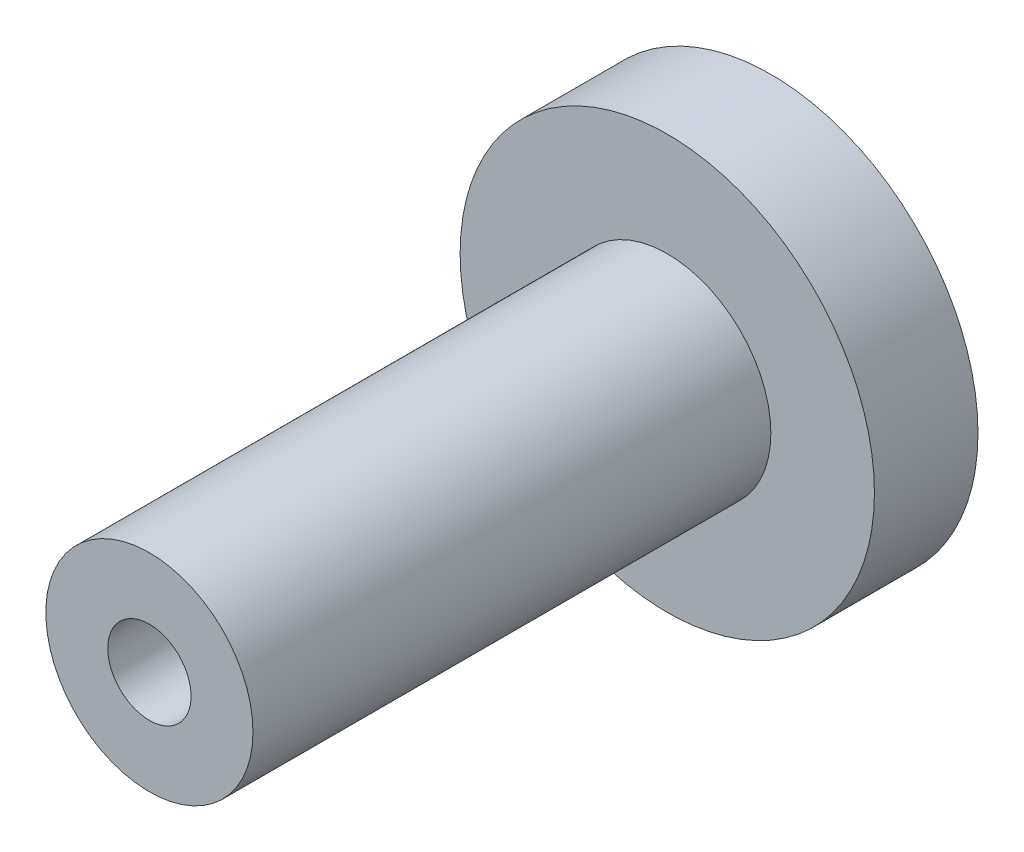
ISO-10303-21;
HEADER;
FILE_DESCRIPTION(('STEP AP214'),'2;1');
FILE_NAME('part.step','',(''),(''),'','','');
FILE_SCHEMA(('AUTOMOTIVE_DESIGN { 1 0 10303 214 1 1 1 1 }'));
ENDSEC;
DATA;
#1=APPLICATION_CONTEXT('core data for automotive mechanical design processes');
#2=APPLICATION_PROTOCOL_DEFINITION('international standard','automotive_design',2000,#1);
#3=PRODUCT_CONTEXT('',#1,'mechanical');
#4=PRODUCT('Part','Part','',(#3));
#5=PRODUCT_RELATED_PRODUCT_CATEGORY('part','',(#4));
#6=PRODUCT_DEFINITION_FORMATION('','',#4);
#7=PRODUCT_DEFINITION_CONTEXT('part definition',#1,'design');
#8=PRODUCT_DEFINITION('design','',#6,#7);
#9=PRODUCT_DEFINITION_SHAPE('','',#8);
#10=(LENGTH_UNIT() NAMED_UNIT(*) SI_UNIT(.MILLI.,.METRE.));
#11=(NAMED_UNIT(*) PLANE_ANGLE_UNIT() SI_UNIT($,.RADIAN.));
#12=(NAMED_UNIT(*) SI_UNIT($,.STERADIAN.) SOLID_ANGLE_UNIT());
#13=UNCERTAINTY_MEASURE_WITH_UNIT(LENGTH_MEASURE(1.E-05),#10,'distance_accuracy_value','');
#14=(GEOMETRIC_REPRESENTATION_CONTEXT(3) GLOBAL_UNCERTAINTY_ASSIGNED_CONTEXT((#13)) GLOBAL_UNIT_ASSIGNED_CONTEXT((#10,
#11,#12)) REPRESENTATION_CONTEXT('',''));
#15=CARTESIAN_POINT('',(0.,0.,0.));
#16=DIRECTION('',(0.,0.,1.));
#17=DIRECTION('',(1.,0.,0.));
#18=AXIS2_PLACEMENT_3D('',#15,#16,#17);
#19=CARTESIAN_POINT('',(0.,0.,38.1));
#20=DIRECTION('',(0.,0.,1.));
#21=DIRECTION('',(1.,0.,0.));
#22=AXIS2_PLACEMENT_3D('',#19,#20,#21);
#23=PLANE('',#22);
#24=CARTESIAN_POINT('',(0.,0.,38.1));
#25=DIRECTION('',(0.,0.,1.));
#26=DIRECTION('',(1.,0.,0.));
#27=AXIS2_PLACEMENT_3D('',#24,#25,#26);
#28=CIRCLE('',#27,2.555);
#29=CARTESIAN_POINT('',(-2.555,0.,38.1));
#30=VERTEX_POINT('',#29);
#31=EDGE_CURVE('E47',#30,#30,#28,.T.);
#32=ORIENTED_EDGE('',*,*,#31,.F.);
#33=EDGE_LOOP('',(#32));
#34=FACE_BOUND('',#33,.T.);
#35=CARTESIAN_POINT('',(0.,0.,38.1));
#36=DIRECTION('',(0.,0.,1.));
#37=DIRECTION('',(1.,0.,0.));
#38=AXIS2_PLACEMENT_3D('',#35,#36,#37);
#39=CIRCLE('',#38,6.35);
#40=CARTESIAN_POINT('',(6.35,0.,38.1));
#41=VERTEX_POINT('',#40);
#42=EDGE_CURVE('E64',#41,#41,#39,.T.);
#43=ORIENTED_EDGE('',*,*,#42,.T.);
#44=EDGE_LOOP('',(#43));
#45=FACE_BOUND('',#44,.T.);
#46=ADVANCED_FACE('F39',(#34,#45),#23,.T.);
#47=CARTESIAN_POINT('',(0.,0.,38.1));
#48=DIRECTION('',(0.,0.,-1.));
#49=DIRECTION('',(-1.,0.,0.));
#50=AXIS2_PLACEMENT_3D('',#47,#48,#49);
#51=CYLINDRICAL_SURFACE('',#50,12.7);
#52=CARTESIAN_POINT('',(0.,0.,0.));
#53=DIRECTION('',(0.,0.,1.));
#54=DIRECTION('',(1.,0.,0.));
#55=AXIS2_PLACEMENT_3D('',#52,#53,#54);
#56=CIRCLE('',#55,12.7);
#57=CARTESIAN_POINT('',(-12.7,0.,0.));
#58=VERTEX_POINT('',#57);
#59=EDGE_CURVE('E10',#58,#58,#56,.T.);
#60=CARTESIAN_POINT('',(0.,0.,6.35));
#61=DIRECTION('',(0.,0.,1.));
#62=DIRECTION('',(1.,0.,0.));
#63=AXIS2_PLACEMENT_3D('',#60,#61,#62);
#64=CIRCLE('',#63,12.7);
#65=CARTESIAN_POINT('',(-12.7,0.,6.34999999999999));
#66=VERTEX_POINT('',#65);
#67=EDGE_CURVE('E58',#66,#66,#64,.T.);
#68=CARTESIAN_POINT('',(-12.7,0.,0.));
#69=CARTESIAN_POINT('',(-12.7,0.,0.0661458333333341));
#70=CARTESIAN_POINT('',(-12.7,0.,0.132291666666668));
#71=CARTESIAN_POINT('',(-12.7,0.,0.264583333333334));
#72=CARTESIAN_POINT('',(-12.7,0.,0.330729166666666));
#73=CARTESIAN_POINT('',(-12.7,0.,0.463020833333332));
#74=CARTESIAN_POINT('',(-12.7,0.,0.529166666666666));
#75=CARTESIAN_POINT('',(-12.7,0.,0.661458333333332));
#76=CARTESIAN_POINT('',(-12.7,0.,0.727604166666664));
#77=CARTESIAN_POINT('',(-12.7,0.,0.85989583333333));
#78=CARTESIAN_POINT('',(-12.7,0.,0.926041666666664));
#79=CARTESIAN_POINT('',(-12.7,0.,1.05833333333333));
#80=CARTESIAN_POINT('',(-12.7,0.,1.12447916666667));
#81=CARTESIAN_POINT('',(-12.7,0.,1.25677083333333));
#82=CARTESIAN_POINT('',(-12.7,0.,1.32291666666666));
#83=CARTESIAN_POINT('',(-12.7,0.,1.45520833333333));
#84=CARTESIAN_POINT('',(-12.7,0.,1.52135416666666));
#85=CARTESIAN_POINT('',(-12.7,0.,1.65364583333333));
#86=CARTESIAN_POINT('',(-12.7,0.,1.71979166666667));
#87=CARTESIAN_POINT('',(-12.7,0.,1.85208333333333));
#88=CARTESIAN_POINT('',(-12.7,0.,1.91822916666666));
#89=CARTESIAN_POINT('',(-12.7,0.,2.05052083333333));
#90=CARTESIAN_POINT('',(-12.7,0.,2.11666666666666));
#91=CARTESIAN_POINT('',(-12.7,0.,2.24895833333333));
#92=CARTESIAN_POINT('',(-12.7,0.,2.31510416666667));
#93=CARTESIAN_POINT('',(-12.7,0.,2.44739583333333));
#94=CARTESIAN_POINT('',(-12.7,0.,2.51354166666667));
#95=CARTESIAN_POINT('',(-12.7,0.,2.64583333333333));
#96=CARTESIAN_POINT('',(-12.7,0.,2.71197916666667));
#97=CARTESIAN_POINT('',(-12.7,0.,2.84427083333333));
#98=CARTESIAN_POINT('',(-12.7,0.,2.91041666666666));
#99=CARTESIAN_POINT('',(-12.7,0.,3.04270833333333));
#100=CARTESIAN_POINT('',(-12.7,0.,3.10885416666666));
#101=CARTESIAN_POINT('',(-12.7,0.,3.24114583333333));
#102=CARTESIAN_POINT('',(-12.7,0.,3.30729166666667));
#103=CARTESIAN_POINT('',(-12.7,0.,3.43958333333333));
#104=CARTESIAN_POINT('',(-12.7,0.,3.50572916666666));
#105=CARTESIAN_POINT('',(-12.7,0.,3.63802083333333));
#106=CARTESIAN_POINT('',(-12.7,0.,3.70416666666666));
#107=CARTESIAN_POINT('',(-12.7,0.,3.83645833333333));
#108=CARTESIAN_POINT('',(-12.7,0.,3.90260416666666));
#109=CARTESIAN_POINT('',(-12.7,0.,4.03489583333333));
#110=CARTESIAN_POINT('',(-12.7,0.,4.10104166666666));
#111=CARTESIAN_POINT('',(-12.7,0.,4.23333333333333));
#112=CARTESIAN_POINT('',(-12.7,0.,4.29947916666666));
#113=CARTESIAN_POINT('',(-12.7,0.,4.43177083333333));
#114=CARTESIAN_POINT('',(-12.7,0.,4.49791666666666));
#115=CARTESIAN_POINT('',(-12.7,0.,4.63020833333333));
#116=CARTESIAN_POINT('',(-12.7,0.,4.69635416666666));
#117=CARTESIAN_POINT('',(-12.7,0.,4.82864583333333));
#118=CARTESIAN_POINT('',(-12.7,0.,4.89479166666666));
#119=CARTESIAN_POINT('',(-12.7,0.,5.02708333333333));
#120=CARTESIAN_POINT('',(-12.7,0.,5.09322916666666));
#121=CARTESIAN_POINT('',(-12.7,0.,5.22552083333333));
#122=CARTESIAN_POINT('',(-12.7,0.,5.29166666666666));
#123=CARTESIAN_POINT('',(-12.7,0.,5.42395833333333));
#124=CARTESIAN_POINT('',(-12.7,0.,5.49010416666667));
#125=CARTESIAN_POINT('',(-12.7,0.,5.62239583333333));
#126=CARTESIAN_POINT('',(-12.7,0.,5.68854166666666));
#127=CARTESIAN_POINT('',(-12.7,0.,5.82083333333333));
#128=CARTESIAN_POINT('',(-12.7,0.,5.88697916666666));
#129=CARTESIAN_POINT('',(-12.7,0.,6.01927083333333));
#130=CARTESIAN_POINT('',(-12.7,0.,6.08541666666666));
#131=CARTESIAN_POINT('',(-12.7,0.,6.21770833333333));
#132=CARTESIAN_POINT('',(-12.7,0.,6.28385416666666));
#133=CARTESIAN_POINT('',(-12.7,0.,6.34999999999999));
#134=B_SPLINE_CURVE_WITH_KNOTS('',3,(#68,#69,#70,#71,#72,#73,#74,#75,#76,#77,#78,#79,#80,#81,
#82,#83,#84,#85,#86,#87,#88,#89,#90,#91,#92,#93,#94,#95,#96,#97,#98,#99,#100,#101,#102,#103,
#104,#105,#106,#107,#108,#109,#110,#111,#112,#113,#114,#115,#116,#117,#118,#119,#120,#121,#122,
#123,#124,#125,#126,#127,#128,#129,#130,#131,#132,#133),.UNSPECIFIED.,.F.,.F.,(4,2,2,2,2,2,2,2,
2,2,2,2,2,2,2,2,2,2,2,2,2,2,2,2,2,2,2,2,2,2,2,2,4),(0.,0.198437500000002,0.396874999999998,
0.5953125,0.793749999999996,0.992187499999998,1.190625,1.3890625,1.5875,1.7859375,1.984375,
2.1828125,2.38125,2.5796875,2.778125,2.97656249999999,3.175,3.3734375,3.571875,3.7703125,
3.96874999999999,4.1671875,4.365625,4.56406249999999,4.7625,4.9609375,5.15937499999999,
5.3578125,5.55625,5.75468749999999,5.953125,6.15156249999999,6.34999999999999),.UNSPECIFIED.);
#135=EDGE_CURVE('BSEAM41',#58,#66,#134,.T.);
#136=ORIENTED_EDGE('',*,*,#59,.T.);
#137=ORIENTED_EDGE('',*,*,#67,.F.);
#138=ORIENTED_EDGE('',*,*,#135,.T.);
#139=ORIENTED_EDGE('',*,*,#135,.F.);
#140=EDGE_LOOP('',(#136,#138,#137,#139));
#141=FACE_BOUND('',#140,.T.);
#142=ADVANCED_FACE('F41',(#141),#51,.T.);
#143=CARTESIAN_POINT('',(0.,0.,0.));
#144=DIRECTION('',(0.,0.,1.));
#145=DIRECTION('',(1.,0.,0.));
#146=AXIS2_PLACEMENT_3D('',#143,#144,#145);
#147=PLANE('',#146);
#148=ORIENTED_EDGE('',*,*,#59,.F.);
#149=EDGE_LOOP('',(#148));
#150=FACE_BOUND('',#149,.T.);
#151=CARTESIAN_POINT('',(0.,0.,0.));
#152=DIRECTION('',(0.,0.,1.));
#153=DIRECTION('',(1.,0.,0.));
#154=AXIS2_PLACEMENT_3D('',#151,#152,#153);
#155=CIRCLE('',#154,2.555);
#156=CARTESIAN_POINT('',(-2.555,0.,0.));
#157=VERTEX_POINT('',#156);
#158=EDGE_CURVE('E52',#157,#157,#155,.T.);
#159=ORIENTED_EDGE('',*,*,#158,.T.);
#160=EDGE_LOOP('',(#159));
#161=FACE_BOUND('',#160,.T.);
#162=ADVANCED_FACE('F83',(#150,#161),#147,.F.);
#163=CARTESIAN_POINT('',(0.,0.,38.1));
#164=DIRECTION('',(0.,0.,-1.));
#165=DIRECTION('',(-1.,0.,0.));
#166=AXIS2_PLACEMENT_3D('',#163,#164,#165);
#167=CYLINDRICAL_SURFACE('',#166,2.555);
#168=CARTESIAN_POINT('',(-2.555,0.,38.1));
#169=CARTESIAN_POINT('',(-2.555,0.,37.703125));
#170=CARTESIAN_POINT('',(-2.555,0.,37.30625));
#171=CARTESIAN_POINT('',(-2.555,0.,36.5125));
#172=CARTESIAN_POINT('',(-2.555,0.,36.115625));
#173=CARTESIAN_POINT('',(-2.555,0.,35.321875));
#174=CARTESIAN_POINT('',(-2.555,0.,34.925));
#175=CARTESIAN_POINT('',(-2.555,0.,34.13125));
#176=CARTESIAN_POINT('',(-2.555,0.,33.734375));
#177=CARTESIAN_POINT('',(-2.555,0.,32.940625));
#178=CARTESIAN_POINT('',(-2.555,0.,32.54375));
#179=CARTESIAN_POINT('',(-2.555,0.,31.75));
#180=CARTESIAN_POINT('',(-2.555,0.,31.353125));
#181=CARTESIAN_POINT('',(-2.555,0.,30.559375));
#182=CARTESIAN_POINT('',(-2.555,0.,30.1625));
#183=CARTESIAN_POINT('',(-2.555,0.,29.36875));
#184=CARTESIAN_POINT('',(-2.555,0.,28.971875));
#185=CARTESIAN_POINT('',(-2.555,0.,28.178125));
#186=CARTESIAN_POINT('',(-2.555,0.,27.78125));
#187=CARTESIAN_POINT('',(-2.555,0.,26.9875));
#188=CARTESIAN_POINT('',(-2.555,0.,26.590625));
#189=CARTESIAN_POINT('',(-2.555,0.,25.796875));
#190=CARTESIAN_POINT('',(-2.555,0.,25.4));
#191=CARTESIAN_POINT('',(-2.555,0.,24.60625));
#192=CARTESIAN_POINT('',(-2.555,0.,24.209375));
#193=CARTESIAN_POINT('',(-2.555,0.,23.415625));
#194=CARTESIAN_POINT('',(-2.555,0.,23.01875));
#195=CARTESIAN_POINT('',(-2.555,0.,22.225));
#196=CARTESIAN_POINT('',(-2.555,0.,21.828125));
#197=CARTESIAN_POINT('',(-2.555,0.,21.034375));
#198=CARTESIAN_POINT('',(-2.555,0.,20.6375));
#199=CARTESIAN_POINT('',(-2.555,0.,19.84375));
#200=CARTESIAN_POINT('',(-2.555,0.,19.446875));
#201=CARTESIAN_POINT('',(-2.555,0.,18.653125));
#202=CARTESIAN_POINT('',(-2.555,0.,18.25625));
#203=CARTESIAN_POINT('',(-2.555,0.,17.4625));
#204=CARTESIAN_POINT('',(-2.555,0.,17.065625));
#205=CARTESIAN_POINT('',(-2.555,0.,16.271875));
#206=CARTESIAN_POINT('',(-2.555,0.,15.875));
#207=CARTESIAN_POINT('',(-2.555,0.,15.08125));
#208=CARTESIAN_POINT('',(-2.555,0.,14.684375));
#209=CARTESIAN_POINT('',(-2.555,0.,13.890625));
#210=CARTESIAN_POINT('',(-2.555,0.,13.49375));
#211=CARTESIAN_POINT('',(-2.555,0.,12.7));
#212=CARTESIAN_POINT('',(-2.555,0.,12.303125));
#213=CARTESIAN_POINT('',(-2.555,0.,11.509375));
#214=CARTESIAN_POINT('',(-2.555,0.,11.1125));
#215=CARTESIAN_POINT('',(-2.555,0.,10.31875));
#216=CARTESIAN_POINT('',(-2.555,0.,9.92187499999999));
#217=CARTESIAN_POINT('',(-2.555,0.,9.128125));
#218=CARTESIAN_POINT('',(-2.555,0.,8.73124999999999));
#219=CARTESIAN_POINT('',(-2.555,0.,7.93749999999999));
#220=CARTESIAN_POINT('',(-2.555,0.,7.54062499999999));
#221=CARTESIAN_POINT('',(-2.555,0.,6.746875));
#222=CARTESIAN_POINT('',(-2.555,0.,6.35));
#223=CARTESIAN_POINT('',(-2.555,0.,5.55625));
#224=CARTESIAN_POINT('',(-2.555,0.,5.159375));
#225=CARTESIAN_POINT('',(-2.555,0.,4.365625));
#226=CARTESIAN_POINT('',(-2.555,0.,3.96875));
#227=CARTESIAN_POINT('',(-2.555,0.,3.175));
#228=CARTESIAN_POINT('',(-2.555,0.,2.778125));
#229=CARTESIAN_POINT('',(-2.555,0.,1.984375));
#230=CARTESIAN_POINT('',(-2.555,0.,1.5875));
#231=CARTESIAN_POINT('',(-2.555,0.,0.79375));
#232=CARTESIAN_POINT('',(-2.555,0.,0.396875));
#233=CARTESIAN_POINT('',(-2.555,0.,0.));
#234=B_SPLINE_CURVE_WITH_KNOTS('',3,(#168,#169,#170,#171,#172,#173,#174,#175,#176,#177,#178,
#179,#180,#181,#182,#183,#184,#185,#186,#187,#188,#189,#190,#191,#192,#193,#194,#195,#196,#197,
#198,#199,#200,#201,#202,#203,#204,#205,#206,#207,#208,#209,#210,#211,#212,#213,#214,#215,#216,
#217,#218,#219,#220,#221,#222,#223,#224,#225,#226,#227,#228,#229,#230,#231,#232,#233),
.UNSPECIFIED.,.F.,.F.,(4,2,2,2,2,2,2,2,2,2,2,2,2,2,2,2,2,2,2,2,2,2,2,2,2,2,2,2,2,2,2,2,4),(0.,
1.190625,2.38125,3.571875,4.7625,5.953125,7.14375,8.334375,9.52500000000001,10.715625,11.90625,
13.096875,14.2875,15.478125,16.66875,17.859375,19.05,20.240625,21.43125,22.621875,23.8125,
25.003125,26.19375,27.384375,28.575,29.765625,30.95625,32.146875,33.3375,34.528125,35.71875,
36.909375,38.1),.UNSPECIFIED.);
#235=EDGE_CURVE('BSEAM78',#30,#157,#234,.T.);
#236=ORIENTED_EDGE('',*,*,#31,.T.);
#237=ORIENTED_EDGE('',*,*,#158,.F.);
#238=ORIENTED_EDGE('',*,*,#235,.T.);
#239=ORIENTED_EDGE('',*,*,#235,.F.);
#240=EDGE_LOOP('',(#236,#238,#237,#239));
#241=FACE_BOUND('',#240,.T.);
#242=ADVANCED_FACE('F78',(#241),#167,.F.);
#243=CARTESIAN_POINT('',(0.,0.,6.35));
#244=DIRECTION('',(0.,0.,1.));
#245=DIRECTION('',(1.,0.,0.));
#246=AXIS2_PLACEMENT_3D('',#243,#244,#245);
#247=PLANE('',#246);
#248=CARTESIAN_POINT('',(0.,0.,6.35));
#249=DIRECTION('',(0.,0.,1.));
#250=DIRECTION('',(1.,0.,0.));
#251=AXIS2_PLACEMENT_3D('',#248,#249,#250);
#252=CIRCLE('',#251,6.35);
#253=CARTESIAN_POINT('',(6.35,0.,6.35));
#254=VERTEX_POINT('',#253);
#255=EDGE_CURVE('E63',#254,#254,#252,.T.);
#256=ORIENTED_EDGE('',*,*,#255,.F.);
#257=EDGE_LOOP('',(#256));
#258=FACE_BOUND('',#257,.T.);
#259=ORIENTED_EDGE('',*,*,#67,.T.);
#260=EDGE_LOOP('',(#259));
#261=FACE_BOUND('',#260,.T.);
#262=ADVANCED_FACE('F75',(#258,#261),#247,.T.);
#263=CARTESIAN_POINT('',(0.,0.,6.35));
#264=DIRECTION('',(0.,0.,1.));
#265=DIRECTION('',(1.,0.,0.));
#266=AXIS2_PLACEMENT_3D('',#263,#264,#265);
#267=CYLINDRICAL_SURFACE('',#266,6.35);
#268=ORIENTED_EDGE('',*,*,#255,.T.);
#269=EDGE_LOOP('',(#268));
#270=FACE_BOUND('',#269,.T.);
#271=ORIENTED_EDGE('',*,*,#42,.F.);
#272=EDGE_LOOP('',(#271));
#273=FACE_BOUND('',#272,.T.);
#274=ADVANCED_FACE('F72',(#270,#273),#267,.T.);
#275=CLOSED_SHELL('',(#46,#142,#162,#242,#262,#274));
#276=MANIFOLD_SOLID_BREP('B2',#275);
#277=ADVANCED_BREP_SHAPE_REPRESENTATION('',(#18,#276),#14);
#278=SHAPE_DEFINITION_REPRESENTATION(#9,#277);
ENDSEC;
END-ISO-10303-21;
